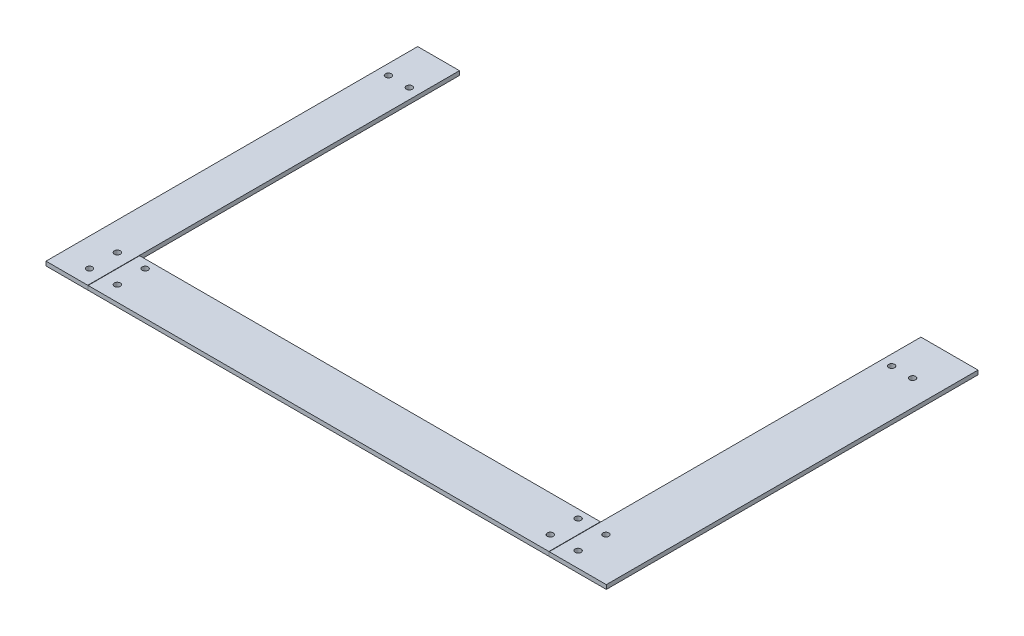
ISO-10303-21;
HEADER;
FILE_DESCRIPTION(('STEP AP214'),'2;1');
FILE_NAME('part.step','',(''),(''),'','','');
FILE_SCHEMA(('AUTOMOTIVE_DESIGN { 1 0 10303 214 1 1 1 1 }'));
ENDSEC;
DATA;
#1=APPLICATION_CONTEXT('core data for automotive mechanical design processes');
#2=APPLICATION_PROTOCOL_DEFINITION('international standard','automotive_design',2000,#1);
#3=PRODUCT_CONTEXT('',#1,'mechanical');
#4=PRODUCT('Part','Part','',(#3));
#5=PRODUCT_RELATED_PRODUCT_CATEGORY('part','',(#4));
#6=PRODUCT_DEFINITION_FORMATION('','',#4);
#7=PRODUCT_DEFINITION_CONTEXT('part definition',#1,'design');
#8=PRODUCT_DEFINITION('design','',#6,#7);
#9=PRODUCT_DEFINITION_SHAPE('','',#8);
#10=(LENGTH_UNIT() NAMED_UNIT(*) SI_UNIT(.MILLI.,.METRE.));
#11=(NAMED_UNIT(*) PLANE_ANGLE_UNIT() SI_UNIT($,.RADIAN.));
#12=(NAMED_UNIT(*) SI_UNIT($,.STERADIAN.) SOLID_ANGLE_UNIT());
#13=UNCERTAINTY_MEASURE_WITH_UNIT(LENGTH_MEASURE(1.E-05),#10,'distance_accuracy_value','');
#14=(GEOMETRIC_REPRESENTATION_CONTEXT(3) GLOBAL_UNCERTAINTY_ASSIGNED_CONTEXT((#13)) GLOBAL_UNIT_ASSIGNED_CONTEXT((#10,
#11,#12)) REPRESENTATION_CONTEXT('',''));
#15=CARTESIAN_POINT('',(0.,0.,0.));
#16=DIRECTION('',(0.,0.,1.));
#17=DIRECTION('',(1.,0.,0.));
#18=AXIS2_PLACEMENT_3D('',#15,#16,#17);
#19=CARTESIAN_POINT('',(165.5,3.,135.5));
#20=DIRECTION('',(-1.,0.,0.));
#21=DIRECTION('',(0.,0.,1.));
#22=AXIS2_PLACEMENT_3D('',#19,#20,#21);
#23=PLANE('',#22);
#24=DIRECTION('',(0.,0.,-1.));
#25=VECTOR('',#24,1.);
#26=CARTESIAN_POINT('',(165.5,0.,135.5));
#27=LINE('',#26,#25);
#28=CARTESIAN_POINT('',(165.5,0.,135.5));
#29=VERTEX_POINT('',#28);
#30=CARTESIAN_POINT('',(165.5,0.,98.5));
#31=VERTEX_POINT('',#30);
#32=EDGE_CURVE('E111',#29,#31,#27,.T.);
#33=ORIENTED_EDGE('',*,*,#32,.T.);
#34=DIRECTION('',(0.,-1.,0.));
#35=VECTOR('',#34,1.);
#36=CARTESIAN_POINT('',(165.5,3.,98.5));
#37=LINE('',#36,#35);
#38=CARTESIAN_POINT('',(165.5,3.,98.5));
#39=VERTEX_POINT('',#38);
#40=EDGE_CURVE('E12',#39,#31,#37,.T.);
#41=ORIENTED_EDGE('',*,*,#40,.F.);
#42=DIRECTION('',(0.,0.,-1.));
#43=VECTOR('',#42,1.);
#44=CARTESIAN_POINT('',(165.5,3.,135.5));
#45=LINE('',#44,#43);
#46=CARTESIAN_POINT('',(165.5,3.,135.5));
#47=VERTEX_POINT('',#46);
#48=EDGE_CURVE('E99',#47,#39,#45,.T.);
#49=ORIENTED_EDGE('',*,*,#48,.F.);
#50=DIRECTION('',(0.,-1.,0.));
#51=VECTOR('',#50,1.);
#52=CARTESIAN_POINT('',(165.5,3.,135.5));
#53=LINE('',#52,#51);
#54=EDGE_CURVE('E107',#47,#29,#53,.T.);
#55=ORIENTED_EDGE('',*,*,#54,.T.);
#56=EDGE_LOOP('',(#33,#41,#49,#55));
#57=FACE_BOUND('',#56,.T.);
#58=ADVANCED_FACE('F48',(#57),#23,.F.);
#59=CARTESIAN_POINT('',(-165.5,3.,98.5));
#60=DIRECTION('',(0.,0.,1.));
#61=DIRECTION('',(1.,0.,0.));
#62=AXIS2_PLACEMENT_3D('',#59,#60,#61);
#63=PLANE('',#62);
#64=DIRECTION('',(-1.,0.,0.));
#65=VECTOR('',#64,1.);
#66=CARTESIAN_POINT('',(-165.5,0.,98.5));
#67=LINE('',#66,#65);
#68=CARTESIAN_POINT('',(-165.5,0.,98.5));
#69=VERTEX_POINT('',#68);
#70=EDGE_CURVE('E103',#31,#69,#67,.T.);
#71=ORIENTED_EDGE('',*,*,#70,.T.);
#72=DIRECTION('',(0.,-1.,0.));
#73=VECTOR('',#72,1.);
#74=CARTESIAN_POINT('',(-165.5,3.,98.5));
#75=LINE('',#74,#73);
#76=CARTESIAN_POINT('',(-165.5,3.,98.5));
#77=VERTEX_POINT('',#76);
#78=EDGE_CURVE('E56',#77,#69,#75,.T.);
#79=ORIENTED_EDGE('',*,*,#78,.F.);
#80=DIRECTION('',(-1.,0.,0.));
#81=VECTOR('',#80,1.);
#82=CARTESIAN_POINT('',(-165.5,3.,98.5));
#83=LINE('',#82,#81);
#84=EDGE_CURVE('E94',#39,#77,#83,.T.);
#85=ORIENTED_EDGE('',*,*,#84,.F.);
#86=ORIENTED_EDGE('',*,*,#40,.T.);
#87=EDGE_LOOP('',(#71,#79,#85,#86));
#88=FACE_BOUND('',#87,.T.);
#89=ADVANCED_FACE('F102',(#88),#63,.F.);
#90=CARTESIAN_POINT('',(-165.5,3.,135.5));
#91=DIRECTION('',(1.,0.,0.));
#92=DIRECTION('',(0.,0.,-1.));
#93=AXIS2_PLACEMENT_3D('',#90,#91,#92);
#94=PLANE('',#93);
#95=DIRECTION('',(0.,0.,1.));
#96=VECTOR('',#95,1.);
#97=CARTESIAN_POINT('',(-165.5,0.,135.5));
#98=LINE('',#97,#96);
#99=CARTESIAN_POINT('',(-165.5,0.,135.5));
#100=VERTEX_POINT('',#99);
#101=EDGE_CURVE('E81',#69,#100,#98,.T.);
#102=ORIENTED_EDGE('',*,*,#101,.T.);
#103=DIRECTION('',(0.,-1.,0.));
#104=VECTOR('',#103,1.);
#105=CARTESIAN_POINT('',(-165.5,3.,135.5));
#106=LINE('',#105,#104);
#107=CARTESIAN_POINT('',(-165.5,3.,135.5));
#108=VERTEX_POINT('',#107);
#109=EDGE_CURVE('E104',#108,#100,#106,.T.);
#110=ORIENTED_EDGE('',*,*,#109,.F.);
#111=DIRECTION('',(0.,0.,1.));
#112=VECTOR('',#111,1.);
#113=CARTESIAN_POINT('',(-165.5,3.,135.5));
#114=LINE('',#113,#112);
#115=EDGE_CURVE('E97',#77,#108,#114,.T.);
#116=ORIENTED_EDGE('',*,*,#115,.F.);
#117=ORIENTED_EDGE('',*,*,#78,.T.);
#118=EDGE_LOOP('',(#102,#110,#116,#117));
#119=FACE_BOUND('',#118,.T.);
#120=ADVANCED_FACE('F105',(#119),#94,.F.);
#121=CARTESIAN_POINT('',(-165.5,3.,135.5));
#122=DIRECTION('',(0.,0.,-1.));
#123=DIRECTION('',(-1.,0.,0.));
#124=AXIS2_PLACEMENT_3D('',#121,#122,#123);
#125=PLANE('',#124);
#126=DIRECTION('',(1.,0.,0.));
#127=VECTOR('',#126,1.);
#128=CARTESIAN_POINT('',(-165.5,0.,135.5));
#129=LINE('',#128,#127);
#130=EDGE_CURVE('E87',#100,#29,#129,.T.);
#131=ORIENTED_EDGE('',*,*,#130,.T.);
#132=ORIENTED_EDGE('',*,*,#54,.F.);
#133=DIRECTION('',(1.,0.,0.));
#134=VECTOR('',#133,1.);
#135=CARTESIAN_POINT('',(-165.5,3.,135.5));
#136=LINE('',#135,#134);
#137=EDGE_CURVE('E64',#108,#47,#136,.T.);
#138=ORIENTED_EDGE('',*,*,#137,.F.);
#139=ORIENTED_EDGE('',*,*,#109,.T.);
#140=EDGE_LOOP('',(#131,#132,#138,#139));
#141=FACE_BOUND('',#140,.T.);
#142=ADVANCED_FACE('F119',(#141),#125,.F.);
#143=CARTESIAN_POINT('',(0.,3.,0.));
#144=DIRECTION('',(0.,-1.,0.));
#145=DIRECTION('',(0.,0.,-1.));
#146=AXIS2_PLACEMENT_3D('',#143,#144,#145);
#147=PLANE('',#146);
#148=CARTESIAN_POINT('',(155.5,3.,124.5));
#149=DIRECTION('',(0.,-1.,0.));
#150=DIRECTION('',(0.,0.,1.));
#151=AXIS2_PLACEMENT_3D('',#148,#149,#150);
#152=CIRCLE('',#151,2.15000000000001);
#153=CARTESIAN_POINT('',(155.5,3.,126.65));
#154=VERTEX_POINT('',#153);
#155=EDGE_CURVE('E142',#154,#154,#152,.T.);
#156=ORIENTED_EDGE('',*,*,#155,.T.);
#157=EDGE_LOOP('',(#156));
#158=FACE_BOUND('',#157,.T.);
#159=CARTESIAN_POINT('',(155.5,3.,104.5));
#160=DIRECTION('',(0.,-1.,0.));
#161=DIRECTION('',(0.,0.,1.));
#162=AXIS2_PLACEMENT_3D('',#159,#160,#161);
#163=CIRCLE('',#162,2.15000000000001);
#164=CARTESIAN_POINT('',(155.5,3.,106.65));
#165=VERTEX_POINT('',#164);
#166=EDGE_CURVE('E136',#165,#165,#163,.T.);
#167=ORIENTED_EDGE('',*,*,#166,.T.);
#168=EDGE_LOOP('',(#167));
#169=FACE_BOUND('',#168,.T.);
#170=CARTESIAN_POINT('',(-155.5,3.,104.5));
#171=DIRECTION('',(0.,1.,0.));
#172=DIRECTION('',(0.,0.,1.));
#173=AXIS2_PLACEMENT_3D('',#170,#171,#172);
#174=CIRCLE('',#173,2.15000000000001);
#175=CARTESIAN_POINT('',(-155.5,3.,106.65));
#176=VERTEX_POINT('',#175);
#177=EDGE_CURVE('E133',#176,#176,#174,.T.);
#178=ORIENTED_EDGE('',*,*,#177,.F.);
#179=EDGE_LOOP('',(#178));
#180=FACE_BOUND('',#179,.T.);
#181=CARTESIAN_POINT('',(-155.5,3.,124.5));
#182=DIRECTION('',(0.,1.,0.));
#183=DIRECTION('',(0.,0.,1.));
#184=AXIS2_PLACEMENT_3D('',#181,#182,#183);
#185=CIRCLE('',#184,2.15000000000001);
#186=CARTESIAN_POINT('',(-155.5,3.,126.65));
#187=VERTEX_POINT('',#186);
#188=EDGE_CURVE('E127',#187,#187,#185,.T.);
#189=ORIENTED_EDGE('',*,*,#188,.F.);
#190=EDGE_LOOP('',(#189));
#191=FACE_BOUND('',#190,.T.);
#192=ORIENTED_EDGE('',*,*,#48,.T.);
#193=ORIENTED_EDGE('',*,*,#84,.T.);
#194=ORIENTED_EDGE('',*,*,#115,.T.);
#195=ORIENTED_EDGE('',*,*,#137,.T.);
#196=EDGE_LOOP('',(#192,#193,#194,#195));
#197=FACE_BOUND('',#196,.T.);
#198=ADVANCED_FACE('F95',(#158,#169,#180,#191,#197),#147,.F.);
#199=CARTESIAN_POINT('',(0.,0.,0.));
#200=DIRECTION('',(0.,-1.,0.));
#201=DIRECTION('',(0.,0.,-1.));
#202=AXIS2_PLACEMENT_3D('',#199,#200,#201);
#203=PLANE('',#202);
#204=CARTESIAN_POINT('',(155.5,0.,124.5));
#205=DIRECTION('',(0.,-1.,0.));
#206=DIRECTION('',(0.,0.,1.));
#207=AXIS2_PLACEMENT_3D('',#204,#205,#206);
#208=CIRCLE('',#207,2.15000000000001);
#209=CARTESIAN_POINT('',(155.5,0.,126.65));
#210=VERTEX_POINT('',#209);
#211=EDGE_CURVE('E145',#210,#210,#208,.T.);
#212=ORIENTED_EDGE('',*,*,#211,.F.);
#213=EDGE_LOOP('',(#212));
#214=FACE_BOUND('',#213,.T.);
#215=CARTESIAN_POINT('',(155.5,0.,104.5));
#216=DIRECTION('',(0.,-1.,0.));
#217=DIRECTION('',(0.,0.,1.));
#218=AXIS2_PLACEMENT_3D('',#215,#216,#217);
#219=CIRCLE('',#218,2.15000000000001);
#220=CARTESIAN_POINT('',(155.5,0.,106.65));
#221=VERTEX_POINT('',#220);
#222=EDGE_CURVE('E139',#221,#221,#219,.T.);
#223=ORIENTED_EDGE('',*,*,#222,.F.);
#224=EDGE_LOOP('',(#223));
#225=FACE_BOUND('',#224,.T.);
#226=CARTESIAN_POINT('',(-155.5,0.,104.5));
#227=DIRECTION('',(0.,1.,0.));
#228=DIRECTION('',(0.,0.,1.));
#229=AXIS2_PLACEMENT_3D('',#226,#227,#228);
#230=CIRCLE('',#229,2.15000000000001);
#231=CARTESIAN_POINT('',(-155.5,0.,106.65));
#232=VERTEX_POINT('',#231);
#233=EDGE_CURVE('E130',#232,#232,#230,.T.);
#234=ORIENTED_EDGE('',*,*,#233,.T.);
#235=EDGE_LOOP('',(#234));
#236=FACE_BOUND('',#235,.T.);
#237=CARTESIAN_POINT('',(-155.5,0.,124.5));
#238=DIRECTION('',(0.,1.,0.));
#239=DIRECTION('',(0.,0.,1.));
#240=AXIS2_PLACEMENT_3D('',#237,#238,#239);
#241=CIRCLE('',#240,2.15000000000001);
#242=CARTESIAN_POINT('',(-155.5,0.,126.65));
#243=VERTEX_POINT('',#242);
#244=EDGE_CURVE('E114',#243,#243,#241,.T.);
#245=ORIENTED_EDGE('',*,*,#244,.T.);
#246=EDGE_LOOP('',(#245));
#247=FACE_BOUND('',#246,.T.);
#248=ORIENTED_EDGE('',*,*,#32,.F.);
#249=ORIENTED_EDGE('',*,*,#130,.F.);
#250=ORIENTED_EDGE('',*,*,#101,.F.);
#251=ORIENTED_EDGE('',*,*,#70,.F.);
#252=EDGE_LOOP('',(#248,#249,#250,#251));
#253=FACE_BOUND('',#252,.T.);
#254=ADVANCED_FACE('F122',(#214,#225,#236,#247,#253),#203,.T.);
#255=CARTESIAN_POINT('',(-155.5,3.,124.5));
#256=DIRECTION('',(0.,1.,0.));
#257=DIRECTION('',(0.,0.,1.));
#258=AXIS2_PLACEMENT_3D('',#255,#256,#257);
#259=CYLINDRICAL_SURFACE('',#258,2.15000000000001);
#260=ORIENTED_EDGE('',*,*,#244,.F.);
#261=EDGE_LOOP('',(#260));
#262=FACE_BOUND('',#261,.T.);
#263=ORIENTED_EDGE('',*,*,#188,.T.);
#264=EDGE_LOOP('',(#263));
#265=FACE_BOUND('',#264,.T.);
#266=ADVANCED_FACE('F154',(#262,#265),#259,.F.);
#267=CARTESIAN_POINT('',(-155.5,3.,104.5));
#268=DIRECTION('',(0.,1.,0.));
#269=DIRECTION('',(0.,0.,1.));
#270=AXIS2_PLACEMENT_3D('',#267,#268,#269);
#271=CYLINDRICAL_SURFACE('',#270,2.15000000000001);
#272=ORIENTED_EDGE('',*,*,#233,.F.);
#273=EDGE_LOOP('',(#272));
#274=FACE_BOUND('',#273,.T.);
#275=ORIENTED_EDGE('',*,*,#177,.T.);
#276=EDGE_LOOP('',(#275));
#277=FACE_BOUND('',#276,.T.);
#278=ADVANCED_FACE('F164',(#274,#277),#271,.F.);
#279=CARTESIAN_POINT('',(155.5,3.,104.5));
#280=DIRECTION('',(0.,1.,0.));
#281=DIRECTION('',(0.,0.,1.));
#282=AXIS2_PLACEMENT_3D('',#279,#280,#281);
#283=CYLINDRICAL_SURFACE('',#282,2.15000000000001);
#284=ORIENTED_EDGE('',*,*,#222,.T.);
#285=EDGE_LOOP('',(#284));
#286=FACE_BOUND('',#285,.T.);
#287=ORIENTED_EDGE('',*,*,#166,.F.);
#288=EDGE_LOOP('',(#287));
#289=FACE_BOUND('',#288,.T.);
#290=ADVANCED_FACE('F206',(#286,#289),#283,.F.);
#291=CARTESIAN_POINT('',(155.5,3.,124.5));
#292=DIRECTION('',(0.,1.,0.));
#293=DIRECTION('',(0.,0.,1.));
#294=AXIS2_PLACEMENT_3D('',#291,#292,#293);
#295=CYLINDRICAL_SURFACE('',#294,2.15000000000001);
#296=ORIENTED_EDGE('',*,*,#211,.T.);
#297=EDGE_LOOP('',(#296));
#298=FACE_BOUND('',#297,.T.);
#299=ORIENTED_EDGE('',*,*,#155,.F.);
#300=EDGE_LOOP('',(#299));
#301=FACE_BOUND('',#300,.T.);
#302=ADVANCED_FACE('F149',(#298,#301),#295,.F.);
#303=CLOSED_SHELL('',(#58,#89,#120,#142,#198,#254,#266,#278,#290,#302));
#304=MANIFOLD_SOLID_BREP('B2',#303);
#305=CARTESIAN_POINT('',(-165.75,3.,135.5));
#306=DIRECTION('',(-1.,0.,0.));
#307=DIRECTION('',(0.,0.,1.));
#308=AXIS2_PLACEMENT_3D('',#305,#306,#307);
#309=PLANE('',#308);
#310=DIRECTION('',(0.,0.,-1.));
#311=VECTOR('',#310,1.);
#312=CARTESIAN_POINT('',(-165.75,0.,135.5));
#313=LINE('',#312,#311);
#314=CARTESIAN_POINT('',(-165.75,0.,135.5));
#315=VERTEX_POINT('',#314);
#316=CARTESIAN_POINT('',(-165.75,0.,-131.5));
#317=VERTEX_POINT('',#316);
#318=EDGE_CURVE('E328',#315,#317,#313,.T.);
#319=ORIENTED_EDGE('',*,*,#318,.T.);
#320=DIRECTION('',(0.,-1.,0.));
#321=VECTOR('',#320,1.);
#322=CARTESIAN_POINT('',(-165.75,3.,-131.5));
#323=LINE('',#322,#321);
#324=CARTESIAN_POINT('',(-165.75,3.,-131.5));
#325=VERTEX_POINT('',#324);
#326=EDGE_CURVE('E46',#325,#317,#323,.T.);
#327=ORIENTED_EDGE('',*,*,#326,.F.);
#328=DIRECTION('',(0.,0.,-1.));
#329=VECTOR('',#328,1.);
#330=CARTESIAN_POINT('',(-165.75,3.,135.5));
#331=LINE('',#330,#329);
#332=CARTESIAN_POINT('',(-165.75,3.,135.5));
#333=VERTEX_POINT('',#332);
#334=EDGE_CURVE('E316',#333,#325,#331,.T.);
#335=ORIENTED_EDGE('',*,*,#334,.F.);
#336=DIRECTION('',(0.,-1.,0.));
#337=VECTOR('',#336,1.);
#338=CARTESIAN_POINT('',(-165.75,3.,135.5));
#339=LINE('',#338,#337);
#340=EDGE_CURVE('E324',#333,#315,#339,.T.);
#341=ORIENTED_EDGE('',*,*,#340,.T.);
#342=EDGE_LOOP('',(#319,#327,#335,#341));
#343=FACE_BOUND('',#342,.T.);
#344=ADVANCED_FACE('F265',(#343),#309,.F.);
#345=CARTESIAN_POINT('',(-195.75,3.,-131.5));
#346=DIRECTION('',(0.,0.,1.));
#347=DIRECTION('',(1.,0.,0.));
#348=AXIS2_PLACEMENT_3D('',#345,#346,#347);
#349=PLANE('',#348);
#350=DIRECTION('',(-1.,0.,0.));
#351=VECTOR('',#350,1.);
#352=CARTESIAN_POINT('',(-195.75,0.,-131.5));
#353=LINE('',#352,#351);
#354=CARTESIAN_POINT('',(-195.75,0.,-131.5));
#355=VERTEX_POINT('',#354);
#356=EDGE_CURVE('E320',#317,#355,#353,.T.);
#357=ORIENTED_EDGE('',*,*,#356,.T.);
#358=DIRECTION('',(0.,-1.,0.));
#359=VECTOR('',#358,1.);
#360=CARTESIAN_POINT('',(-195.75,3.,-131.5));
#361=LINE('',#360,#359);
#362=CARTESIAN_POINT('',(-195.75,3.,-131.5));
#363=VERTEX_POINT('',#362);
#364=EDGE_CURVE('E273',#363,#355,#361,.T.);
#365=ORIENTED_EDGE('',*,*,#364,.F.);
#366=DIRECTION('',(-1.,0.,0.));
#367=VECTOR('',#366,1.);
#368=CARTESIAN_POINT('',(-195.75,3.,-131.5));
#369=LINE('',#368,#367);
#370=EDGE_CURVE('E311',#325,#363,#369,.T.);
#371=ORIENTED_EDGE('',*,*,#370,.F.);
#372=ORIENTED_EDGE('',*,*,#326,.T.);
#373=EDGE_LOOP('',(#357,#365,#371,#372));
#374=FACE_BOUND('',#373,.T.);
#375=ADVANCED_FACE('F319',(#374),#349,.F.);
#376=CARTESIAN_POINT('',(-195.75,3.,135.5));
#377=DIRECTION('',(1.,0.,0.));
#378=DIRECTION('',(0.,0.,-1.));
#379=AXIS2_PLACEMENT_3D('',#376,#377,#378);
#380=PLANE('',#379);
#381=DIRECTION('',(0.,0.,1.));
#382=VECTOR('',#381,1.);
#383=CARTESIAN_POINT('',(-195.75,0.,135.5));
#384=LINE('',#383,#382);
#385=CARTESIAN_POINT('',(-195.75,0.,135.5));
#386=VERTEX_POINT('',#385);
#387=EDGE_CURVE('E298',#355,#386,#384,.T.);
#388=ORIENTED_EDGE('',*,*,#387,.T.);
#389=DIRECTION('',(0.,-1.,0.));
#390=VECTOR('',#389,1.);
#391=CARTESIAN_POINT('',(-195.75,3.,135.5));
#392=LINE('',#391,#390);
#393=CARTESIAN_POINT('',(-195.75,3.,135.5));
#394=VERTEX_POINT('',#393);
#395=EDGE_CURVE('E321',#394,#386,#392,.T.);
#396=ORIENTED_EDGE('',*,*,#395,.F.);
#397=DIRECTION('',(0.,0.,1.));
#398=VECTOR('',#397,1.);
#399=CARTESIAN_POINT('',(-195.75,3.,135.5));
#400=LINE('',#399,#398);
#401=EDGE_CURVE('E314',#363,#394,#400,.T.);
#402=ORIENTED_EDGE('',*,*,#401,.F.);
#403=ORIENTED_EDGE('',*,*,#364,.T.);
#404=EDGE_LOOP('',(#388,#396,#402,#403));
#405=FACE_BOUND('',#404,.T.);
#406=ADVANCED_FACE('F322',(#405),#380,.F.);
#407=CARTESIAN_POINT('',(-195.75,3.,135.5));
#408=DIRECTION('',(0.,0.,-1.));
#409=DIRECTION('',(-1.,0.,0.));
#410=AXIS2_PLACEMENT_3D('',#407,#408,#409);
#411=PLANE('',#410);
#412=DIRECTION('',(1.,0.,0.));
#413=VECTOR('',#412,1.);
#414=CARTESIAN_POINT('',(-195.75,0.,135.5));
#415=LINE('',#414,#413);
#416=EDGE_CURVE('E304',#386,#315,#415,.T.);
#417=ORIENTED_EDGE('',*,*,#416,.T.);
#418=ORIENTED_EDGE('',*,*,#340,.F.);
#419=DIRECTION('',(1.,0.,0.));
#420=VECTOR('',#419,1.);
#421=CARTESIAN_POINT('',(-195.75,3.,135.5));
#422=LINE('',#421,#420);
#423=EDGE_CURVE('E281',#394,#333,#422,.T.);
#424=ORIENTED_EDGE('',*,*,#423,.F.);
#425=ORIENTED_EDGE('',*,*,#395,.T.);
#426=EDGE_LOOP('',(#417,#418,#424,#425));
#427=FACE_BOUND('',#426,.T.);
#428=ADVANCED_FACE('F336',(#427),#411,.F.);
#429=CARTESIAN_POINT('',(0.,3.,0.));
#430=DIRECTION('',(0.,-1.,0.));
#431=DIRECTION('',(0.,0.,-1.));
#432=AXIS2_PLACEMENT_3D('',#429,#430,#431);
#433=PLANE('',#432);
#434=CARTESIAN_POINT('',(-175.5,3.,124.5));
#435=DIRECTION('',(0.,1.,0.));
#436=DIRECTION('',(0.,0.,1.));
#437=AXIS2_PLACEMENT_3D('',#434,#435,#436);
#438=CIRCLE('',#437,2.15000000000001);
#439=CARTESIAN_POINT('',(-175.5,3.,126.65));
#440=VERTEX_POINT('',#439);
#441=EDGE_CURVE('E362',#440,#440,#438,.T.);
#442=ORIENTED_EDGE('',*,*,#441,.F.);
#443=EDGE_LOOP('',(#442));
#444=FACE_BOUND('',#443,.T.);
#445=CARTESIAN_POINT('',(-175.5,3.,104.5));
#446=DIRECTION('',(0.,1.,0.));
#447=DIRECTION('',(0.,0.,1.));
#448=AXIS2_PLACEMENT_3D('',#445,#446,#447);
#449=CIRCLE('',#448,2.15000000000001);
#450=CARTESIAN_POINT('',(-175.5,3.,106.65));
#451=VERTEX_POINT('',#450);
#452=EDGE_CURVE('E356',#451,#451,#449,.T.);
#453=ORIENTED_EDGE('',*,*,#452,.F.);
#454=EDGE_LOOP('',(#453));
#455=FACE_BOUND('',#454,.T.);
#456=CARTESIAN_POINT('',(-188.25,3.,-103.));
#457=DIRECTION('',(0.,1.,0.));
#458=DIRECTION('',(0.,0.,1.));
#459=AXIS2_PLACEMENT_3D('',#456,#457,#458);
#460=CIRCLE('',#459,2.15000000000001);
#461=CARTESIAN_POINT('',(-188.25,3.,-100.85));
#462=VERTEX_POINT('',#461);
#463=EDGE_CURVE('E350',#462,#462,#460,.T.);
#464=ORIENTED_EDGE('',*,*,#463,.F.);
#465=EDGE_LOOP('',(#464));
#466=FACE_BOUND('',#465,.T.);
#467=CARTESIAN_POINT('',(-173.25,3.,-103.));
#468=DIRECTION('',(0.,1.,0.));
#469=DIRECTION('',(0.,0.,1.));
#470=AXIS2_PLACEMENT_3D('',#467,#468,#469);
#471=CIRCLE('',#470,2.15000000000001);
#472=CARTESIAN_POINT('',(-173.25,3.,-100.85));
#473=VERTEX_POINT('',#472);
#474=EDGE_CURVE('E344',#473,#473,#471,.T.);
#475=ORIENTED_EDGE('',*,*,#474,.F.);
#476=EDGE_LOOP('',(#475));
#477=FACE_BOUND('',#476,.T.);
#478=ORIENTED_EDGE('',*,*,#334,.T.);
#479=ORIENTED_EDGE('',*,*,#370,.T.);
#480=ORIENTED_EDGE('',*,*,#401,.T.);
#481=ORIENTED_EDGE('',*,*,#423,.T.);
#482=EDGE_LOOP('',(#478,#479,#480,#481));
#483=FACE_BOUND('',#482,.T.);
#484=ADVANCED_FACE('F312',(#444,#455,#466,#477,#483),#433,.F.);
#485=CARTESIAN_POINT('',(0.,0.,0.));
#486=DIRECTION('',(0.,-1.,0.));
#487=DIRECTION('',(0.,0.,-1.));
#488=AXIS2_PLACEMENT_3D('',#485,#486,#487);
#489=PLANE('',#488);
#490=CARTESIAN_POINT('',(-175.5,0.,124.5));
#491=DIRECTION('',(0.,1.,0.));
#492=DIRECTION('',(0.,0.,1.));
#493=AXIS2_PLACEMENT_3D('',#490,#491,#492);
#494=CIRCLE('',#493,2.14999999999999);
#495=CARTESIAN_POINT('',(-175.5,0.,126.65));
#496=VERTEX_POINT('',#495);
#497=EDGE_CURVE('E359',#496,#496,#494,.T.);
#498=ORIENTED_EDGE('',*,*,#497,.T.);
#499=EDGE_LOOP('',(#498));
#500=FACE_BOUND('',#499,.T.);
#501=CARTESIAN_POINT('',(-175.5,0.,104.5));
#502=DIRECTION('',(0.,1.,0.));
#503=DIRECTION('',(0.,0.,1.));
#504=AXIS2_PLACEMENT_3D('',#501,#502,#503);
#505=CIRCLE('',#504,2.14999999999999);
#506=CARTESIAN_POINT('',(-175.5,0.,106.65));
#507=VERTEX_POINT('',#506);
#508=EDGE_CURVE('E353',#507,#507,#505,.T.);
#509=ORIENTED_EDGE('',*,*,#508,.T.);
#510=EDGE_LOOP('',(#509));
#511=FACE_BOUND('',#510,.T.);
#512=CARTESIAN_POINT('',(-188.25,0.,-103.));
#513=DIRECTION('',(0.,1.,0.));
#514=DIRECTION('',(0.,0.,1.));
#515=AXIS2_PLACEMENT_3D('',#512,#513,#514);
#516=CIRCLE('',#515,2.14999999999999);
#517=CARTESIAN_POINT('',(-188.25,0.,-100.85));
#518=VERTEX_POINT('',#517);
#519=EDGE_CURVE('E347',#518,#518,#516,.T.);
#520=ORIENTED_EDGE('',*,*,#519,.T.);
#521=EDGE_LOOP('',(#520));
#522=FACE_BOUND('',#521,.T.);
#523=CARTESIAN_POINT('',(-173.25,0.,-103.));
#524=DIRECTION('',(0.,1.,0.));
#525=DIRECTION('',(0.,0.,1.));
#526=AXIS2_PLACEMENT_3D('',#523,#524,#525);
#527=CIRCLE('',#526,2.14999999999999);
#528=CARTESIAN_POINT('',(-173.25,0.,-100.85));
#529=VERTEX_POINT('',#528);
#530=EDGE_CURVE('E331',#529,#529,#527,.T.);
#531=ORIENTED_EDGE('',*,*,#530,.T.);
#532=EDGE_LOOP('',(#531));
#533=FACE_BOUND('',#532,.T.);
#534=ORIENTED_EDGE('',*,*,#318,.F.);
#535=ORIENTED_EDGE('',*,*,#416,.F.);
#536=ORIENTED_EDGE('',*,*,#387,.F.);
#537=ORIENTED_EDGE('',*,*,#356,.F.);
#538=EDGE_LOOP('',(#534,#535,#536,#537));
#539=FACE_BOUND('',#538,.T.);
#540=ADVANCED_FACE('F339',(#500,#511,#522,#533,#539),#489,.T.);
#541=CARTESIAN_POINT('',(-173.25,3.,-103.));
#542=DIRECTION('',(0.,1.,0.));
#543=DIRECTION('',(0.,0.,1.));
#544=AXIS2_PLACEMENT_3D('',#541,#542,#543);
#545=CYLINDRICAL_SURFACE('',#544,2.15);
#546=ORIENTED_EDGE('',*,*,#530,.F.);
#547=EDGE_LOOP('',(#546));
#548=FACE_BOUND('',#547,.T.);
#549=ORIENTED_EDGE('',*,*,#474,.T.);
#550=EDGE_LOOP('',(#549));
#551=FACE_BOUND('',#550,.T.);
#552=ADVANCED_FACE('F377',(#548,#551),#545,.F.);
#553=CARTESIAN_POINT('',(-188.25,3.,-103.));
#554=DIRECTION('',(0.,1.,0.));
#555=DIRECTION('',(0.,0.,1.));
#556=AXIS2_PLACEMENT_3D('',#553,#554,#555);
#557=CYLINDRICAL_SURFACE('',#556,2.15);
#558=ORIENTED_EDGE('',*,*,#519,.F.);
#559=EDGE_LOOP('',(#558));
#560=FACE_BOUND('',#559,.T.);
#561=ORIENTED_EDGE('',*,*,#463,.T.);
#562=EDGE_LOOP('',(#561));
#563=FACE_BOUND('',#562,.T.);
#564=ADVANCED_FACE('F379',(#560,#563),#557,.F.);
#565=CARTESIAN_POINT('',(-175.5,3.,104.5));
#566=DIRECTION('',(0.,1.,0.));
#567=DIRECTION('',(0.,0.,1.));
#568=AXIS2_PLACEMENT_3D('',#565,#566,#567);
#569=CYLINDRICAL_SURFACE('',#568,2.15);
#570=ORIENTED_EDGE('',*,*,#508,.F.);
#571=EDGE_LOOP('',(#570));
#572=FACE_BOUND('',#571,.T.);
#573=ORIENTED_EDGE('',*,*,#452,.T.);
#574=EDGE_LOOP('',(#573));
#575=FACE_BOUND('',#574,.T.);
#576=ADVANCED_FACE('F386',(#572,#575),#569,.F.);
#577=CARTESIAN_POINT('',(-175.5,3.,124.5));
#578=DIRECTION('',(0.,1.,0.));
#579=DIRECTION('',(0.,0.,1.));
#580=AXIS2_PLACEMENT_3D('',#577,#578,#579);
#581=CYLINDRICAL_SURFACE('',#580,2.15);
#582=ORIENTED_EDGE('',*,*,#497,.F.);
#583=EDGE_LOOP('',(#582));
#584=FACE_BOUND('',#583,.T.);
#585=ORIENTED_EDGE('',*,*,#441,.T.);
#586=EDGE_LOOP('',(#585));
#587=FACE_BOUND('',#586,.T.);
#588=ADVANCED_FACE('F366',(#584,#587),#581,.F.);
#589=CLOSED_SHELL('',(#344,#375,#406,#428,#484,#540,#552,#564,#576,#588));
#590=MANIFOLD_SOLID_BREP('B6',#589);
#591=CARTESIAN_POINT('',(206.75,3.,135.5));
#592=DIRECTION('',(-1.,0.,0.));
#593=DIRECTION('',(0.,0.,1.));
#594=AXIS2_PLACEMENT_3D('',#591,#592,#593);
#595=PLANE('',#594);
#596=DIRECTION('',(0.,0.,-1.));
#597=VECTOR('',#596,1.);
#598=CARTESIAN_POINT('',(206.75,0.,135.5));
#599=LINE('',#598,#597);
#600=CARTESIAN_POINT('',(206.75,0.,135.5));
#601=VERTEX_POINT('',#600);
#602=CARTESIAN_POINT('',(206.75,0.,-131.5));
#603=VERTEX_POINT('',#602);
#604=EDGE_CURVE('E536',#601,#603,#599,.T.);
#605=ORIENTED_EDGE('',*,*,#604,.T.);
#606=DIRECTION('',(0.,-1.,0.));
#607=VECTOR('',#606,1.);
#608=CARTESIAN_POINT('',(206.75,3.,-131.5));
#609=LINE('',#608,#607);
#610=CARTESIAN_POINT('',(206.75,3.,-131.5));
#611=VERTEX_POINT('',#610);
#612=EDGE_CURVE('E263',#611,#603,#609,.T.);
#613=ORIENTED_EDGE('',*,*,#612,.F.);
#614=DIRECTION('',(0.,0.,-1.));
#615=VECTOR('',#614,1.);
#616=CARTESIAN_POINT('',(206.75,3.,135.5));
#617=LINE('',#616,#615);
#618=CARTESIAN_POINT('',(206.75,3.,135.5));
#619=VERTEX_POINT('',#618);
#620=EDGE_CURVE('E524',#619,#611,#617,.T.);
#621=ORIENTED_EDGE('',*,*,#620,.F.);
#622=DIRECTION('',(0.,-1.,0.));
#623=VECTOR('',#622,1.);
#624=CARTESIAN_POINT('',(206.75,3.,135.5));
#625=LINE('',#624,#623);
#626=EDGE_CURVE('E532',#619,#601,#625,.T.);
#627=ORIENTED_EDGE('',*,*,#626,.T.);
#628=EDGE_LOOP('',(#605,#613,#621,#627));
#629=FACE_BOUND('',#628,.T.);
#630=ADVANCED_FACE('F473',(#629),#595,.F.);
#631=CARTESIAN_POINT('',(165.75,3.,-131.5));
#632=DIRECTION('',(0.,0.,1.));
#633=DIRECTION('',(1.,0.,0.));
#634=AXIS2_PLACEMENT_3D('',#631,#632,#633);
#635=PLANE('',#634);
#636=DIRECTION('',(-1.,0.,0.));
#637=VECTOR('',#636,1.);
#638=CARTESIAN_POINT('',(165.75,0.,-131.5));
#639=LINE('',#638,#637);
#640=CARTESIAN_POINT('',(165.75,0.,-131.5));
#641=VERTEX_POINT('',#640);
#642=EDGE_CURVE('E528',#603,#641,#639,.T.);
#643=ORIENTED_EDGE('',*,*,#642,.T.);
#644=DIRECTION('',(0.,-1.,0.));
#645=VECTOR('',#644,1.);
#646=CARTESIAN_POINT('',(165.75,3.,-131.5));
#647=LINE('',#646,#645);
#648=CARTESIAN_POINT('',(165.75,3.,-131.5));
#649=VERTEX_POINT('',#648);
#650=EDGE_CURVE('E481',#649,#641,#647,.T.);
#651=ORIENTED_EDGE('',*,*,#650,.F.);
#652=DIRECTION('',(-1.,0.,0.));
#653=VECTOR('',#652,1.);
#654=CARTESIAN_POINT('',(165.75,3.,-131.5));
#655=LINE('',#654,#653);
#656=EDGE_CURVE('E519',#611,#649,#655,.T.);
#657=ORIENTED_EDGE('',*,*,#656,.F.);
#658=ORIENTED_EDGE('',*,*,#612,.T.);
#659=EDGE_LOOP('',(#643,#651,#657,#658));
#660=FACE_BOUND('',#659,.T.);
#661=ADVANCED_FACE('F527',(#660),#635,.F.);
#662=CARTESIAN_POINT('',(165.75,3.,135.5));
#663=DIRECTION('',(1.,0.,0.));
#664=DIRECTION('',(0.,0.,-1.));
#665=AXIS2_PLACEMENT_3D('',#662,#663,#664);
#666=PLANE('',#665);
#667=DIRECTION('',(0.,0.,1.));
#668=VECTOR('',#667,1.);
#669=CARTESIAN_POINT('',(165.75,0.,135.5));
#670=LINE('',#669,#668);
#671=CARTESIAN_POINT('',(165.75,0.,135.5));
#672=VERTEX_POINT('',#671);
#673=EDGE_CURVE('E506',#641,#672,#670,.T.);
#674=ORIENTED_EDGE('',*,*,#673,.T.);
#675=DIRECTION('',(0.,-1.,0.));
#676=VECTOR('',#675,1.);
#677=CARTESIAN_POINT('',(165.75,3.,135.5));
#678=LINE('',#677,#676);
#679=CARTESIAN_POINT('',(165.75,3.,135.5));
#680=VERTEX_POINT('',#679);
#681=EDGE_CURVE('E529',#680,#672,#678,.T.);
#682=ORIENTED_EDGE('',*,*,#681,.F.);
#683=DIRECTION('',(0.,0.,1.));
#684=VECTOR('',#683,1.);
#685=CARTESIAN_POINT('',(165.75,3.,135.5));
#686=LINE('',#685,#684);
#687=EDGE_CURVE('E522',#649,#680,#686,.T.);
#688=ORIENTED_EDGE('',*,*,#687,.F.);
#689=ORIENTED_EDGE('',*,*,#650,.T.);
#690=EDGE_LOOP('',(#674,#682,#688,#689));
#691=FACE_BOUND('',#690,.T.);
#692=ADVANCED_FACE('F530',(#691),#666,.F.);
#693=CARTESIAN_POINT('',(165.75,3.,135.5));
#694=DIRECTION('',(0.,0.,-1.));
#695=DIRECTION('',(-1.,0.,0.));
#696=AXIS2_PLACEMENT_3D('',#693,#694,#695);
#697=PLANE('',#696);
#698=DIRECTION('',(1.,0.,0.));
#699=VECTOR('',#698,1.);
#700=CARTESIAN_POINT('',(165.75,0.,135.5));
#701=LINE('',#700,#699);
#702=EDGE_CURVE('E512',#672,#601,#701,.T.);
#703=ORIENTED_EDGE('',*,*,#702,.T.);
#704=ORIENTED_EDGE('',*,*,#626,.F.);
#705=DIRECTION('',(1.,0.,0.));
#706=VECTOR('',#705,1.);
#707=CARTESIAN_POINT('',(165.75,3.,135.5));
#708=LINE('',#707,#706);
#709=EDGE_CURVE('E489',#680,#619,#708,.T.);
#710=ORIENTED_EDGE('',*,*,#709,.F.);
#711=ORIENTED_EDGE('',*,*,#681,.T.);
#712=EDGE_LOOP('',(#703,#704,#710,#711));
#713=FACE_BOUND('',#712,.T.);
#714=ADVANCED_FACE('F544',(#713),#697,.F.);
#715=CARTESIAN_POINT('',(0.,3.,0.));
#716=DIRECTION('',(0.,-1.,0.));
#717=DIRECTION('',(0.,0.,-1.));
#718=AXIS2_PLACEMENT_3D('',#715,#716,#717);
#719=PLANE('',#718);
#720=CARTESIAN_POINT('',(175.5,3.,104.5));
#721=DIRECTION('',(0.,-1.,0.));
#722=DIRECTION('',(0.,0.,1.));
#723=AXIS2_PLACEMENT_3D('',#720,#721,#722);
#724=CIRCLE('',#723,2.15000000000001);
#725=CARTESIAN_POINT('',(175.5,3.,106.65));
#726=VERTEX_POINT('',#725);
#727=EDGE_CURVE('E567',#726,#726,#724,.T.);
#728=ORIENTED_EDGE('',*,*,#727,.T.);
#729=EDGE_LOOP('',(#728));
#730=FACE_BOUND('',#729,.T.);
#731=CARTESIAN_POINT('',(188.25,3.,-103.));
#732=DIRECTION('',(0.,-1.,0.));
#733=DIRECTION('',(0.,0.,1.));
#734=AXIS2_PLACEMENT_3D('',#731,#732,#733);
#735=CIRCLE('',#734,2.15000000000001);
#736=CARTESIAN_POINT('',(188.25,3.,-100.85));
#737=VERTEX_POINT('',#736);
#738=EDGE_CURVE('E561',#737,#737,#735,.T.);
#739=ORIENTED_EDGE('',*,*,#738,.T.);
#740=EDGE_LOOP('',(#739));
#741=FACE_BOUND('',#740,.T.);
#742=CARTESIAN_POINT('',(173.25,3.,-103.));
#743=DIRECTION('',(0.,-1.,0.));
#744=DIRECTION('',(0.,0.,1.));
#745=AXIS2_PLACEMENT_3D('',#742,#743,#744);
#746=CIRCLE('',#745,2.15000000000001);
#747=CARTESIAN_POINT('',(173.25,3.,-100.85));
#748=VERTEX_POINT('',#747);
#749=EDGE_CURVE('E555',#748,#748,#746,.T.);
#750=ORIENTED_EDGE('',*,*,#749,.T.);
#751=EDGE_LOOP('',(#750));
#752=FACE_BOUND('',#751,.T.);
#753=CARTESIAN_POINT('',(175.5,3.,124.5));
#754=DIRECTION('',(0.,-1.,0.));
#755=DIRECTION('',(0.,0.,1.));
#756=AXIS2_PLACEMENT_3D('',#753,#754,#755);
#757=CIRCLE('',#756,2.15000000000001);
#758=CARTESIAN_POINT('',(175.5,3.,126.65));
#759=VERTEX_POINT('',#758);
#760=EDGE_CURVE('E539',#759,#759,#757,.T.);
#761=ORIENTED_EDGE('',*,*,#760,.T.);
#762=EDGE_LOOP('',(#761));
#763=FACE_BOUND('',#762,.T.);
#764=ORIENTED_EDGE('',*,*,#620,.T.);
#765=ORIENTED_EDGE('',*,*,#656,.T.);
#766=ORIENTED_EDGE('',*,*,#687,.T.);
#767=ORIENTED_EDGE('',*,*,#709,.T.);
#768=EDGE_LOOP('',(#764,#765,#766,#767));
#769=FACE_BOUND('',#768,.T.);
#770=ADVANCED_FACE('F520',(#730,#741,#752,#763,#769),#719,.F.);
#771=CARTESIAN_POINT('',(0.,0.,0.));
#772=DIRECTION('',(0.,-1.,0.));
#773=DIRECTION('',(0.,0.,-1.));
#774=AXIS2_PLACEMENT_3D('',#771,#772,#773);
#775=PLANE('',#774);
#776=CARTESIAN_POINT('',(175.5,0.,104.5));
#777=DIRECTION('',(0.,-1.,0.));
#778=DIRECTION('',(0.,0.,1.));
#779=AXIS2_PLACEMENT_3D('',#776,#777,#778);
#780=CIRCLE('',#779,2.14999999999999);
#781=CARTESIAN_POINT('',(175.5,0.,106.65));
#782=VERTEX_POINT('',#781);
#783=EDGE_CURVE('E570',#782,#782,#780,.T.);
#784=ORIENTED_EDGE('',*,*,#783,.F.);
#785=EDGE_LOOP('',(#784));
#786=FACE_BOUND('',#785,.T.);
#787=CARTESIAN_POINT('',(188.25,0.,-103.));
#788=DIRECTION('',(0.,-1.,0.));
#789=DIRECTION('',(0.,0.,1.));
#790=AXIS2_PLACEMENT_3D('',#787,#788,#789);
#791=CIRCLE('',#790,2.14999999999999);
#792=CARTESIAN_POINT('',(188.25,0.,-100.85));
#793=VERTEX_POINT('',#792);
#794=EDGE_CURVE('E564',#793,#793,#791,.T.);
#795=ORIENTED_EDGE('',*,*,#794,.F.);
#796=EDGE_LOOP('',(#795));
#797=FACE_BOUND('',#796,.T.);
#798=CARTESIAN_POINT('',(173.25,0.,-103.));
#799=DIRECTION('',(0.,-1.,0.));
#800=DIRECTION('',(0.,0.,1.));
#801=AXIS2_PLACEMENT_3D('',#798,#799,#800);
#802=CIRCLE('',#801,2.14999999999999);
#803=CARTESIAN_POINT('',(173.25,0.,-100.85));
#804=VERTEX_POINT('',#803);
#805=EDGE_CURVE('E558',#804,#804,#802,.T.);
#806=ORIENTED_EDGE('',*,*,#805,.F.);
#807=EDGE_LOOP('',(#806));
#808=FACE_BOUND('',#807,.T.);
#809=CARTESIAN_POINT('',(175.5,0.,124.5));
#810=DIRECTION('',(0.,-1.,0.));
#811=DIRECTION('',(0.,0.,1.));
#812=AXIS2_PLACEMENT_3D('',#809,#810,#811);
#813=CIRCLE('',#812,2.14999999999999);
#814=CARTESIAN_POINT('',(175.5,0.,126.65));
#815=VERTEX_POINT('',#814);
#816=EDGE_CURVE('E552',#815,#815,#813,.T.);
#817=ORIENTED_EDGE('',*,*,#816,.F.);
#818=EDGE_LOOP('',(#817));
#819=FACE_BOUND('',#818,.T.);
#820=ORIENTED_EDGE('',*,*,#604,.F.);
#821=ORIENTED_EDGE('',*,*,#702,.F.);
#822=ORIENTED_EDGE('',*,*,#673,.F.);
#823=ORIENTED_EDGE('',*,*,#642,.F.);
#824=EDGE_LOOP('',(#820,#821,#822,#823));
#825=FACE_BOUND('',#824,.T.);
#826=ADVANCED_FACE('F547',(#786,#797,#808,#819,#825),#775,.T.);
#827=CARTESIAN_POINT('',(175.5,3.,124.5));
#828=DIRECTION('',(0.,1.,0.));
#829=DIRECTION('',(0.,0.,1.));
#830=AXIS2_PLACEMENT_3D('',#827,#828,#829);
#831=CYLINDRICAL_SURFACE('',#830,2.15);
#832=ORIENTED_EDGE('',*,*,#816,.T.);
#833=EDGE_LOOP('',(#832));
#834=FACE_BOUND('',#833,.T.);
#835=ORIENTED_EDGE('',*,*,#760,.F.);
#836=EDGE_LOOP('',(#835));
#837=FACE_BOUND('',#836,.T.);
#838=ADVANCED_FACE('F579',(#834,#837),#831,.F.);
#839=CARTESIAN_POINT('',(173.25,3.,-103.));
#840=DIRECTION('',(0.,1.,0.));
#841=DIRECTION('',(0.,0.,1.));
#842=AXIS2_PLACEMENT_3D('',#839,#840,#841);
#843=CYLINDRICAL_SURFACE('',#842,2.15);
#844=ORIENTED_EDGE('',*,*,#805,.T.);
#845=EDGE_LOOP('',(#844));
#846=FACE_BOUND('',#845,.T.);
#847=ORIENTED_EDGE('',*,*,#749,.F.);
#848=EDGE_LOOP('',(#847));
#849=FACE_BOUND('',#848,.T.);
#850=ADVANCED_FACE('F589',(#846,#849),#843,.F.);
#851=CARTESIAN_POINT('',(188.25,3.,-103.));
#852=DIRECTION('',(0.,1.,0.));
#853=DIRECTION('',(0.,0.,1.));
#854=AXIS2_PLACEMENT_3D('',#851,#852,#853);
#855=CYLINDRICAL_SURFACE('',#854,2.15);
#856=ORIENTED_EDGE('',*,*,#794,.T.);
#857=EDGE_LOOP('',(#856));
#858=FACE_BOUND('',#857,.T.);
#859=ORIENTED_EDGE('',*,*,#738,.F.);
#860=EDGE_LOOP('',(#859));
#861=FACE_BOUND('',#860,.T.);
#862=ADVANCED_FACE('F640',(#858,#861),#855,.F.);
#863=CARTESIAN_POINT('',(175.5,3.,104.5));
#864=DIRECTION('',(0.,1.,0.));
#865=DIRECTION('',(0.,0.,1.));
#866=AXIS2_PLACEMENT_3D('',#863,#864,#865);
#867=CYLINDRICAL_SURFACE('',#866,2.15);
#868=ORIENTED_EDGE('',*,*,#783,.T.);
#869=EDGE_LOOP('',(#868));
#870=FACE_BOUND('',#869,.T.);
#871=ORIENTED_EDGE('',*,*,#727,.F.);
#872=EDGE_LOOP('',(#871));
#873=FACE_BOUND('',#872,.T.);
#874=ADVANCED_FACE('F574',(#870,#873),#867,.F.);
#875=CLOSED_SHELL('',(#630,#661,#692,#714,#770,#826,#838,#850,#862,#874));
#876=MANIFOLD_SOLID_BREP('B40',#875);
#877=ADVANCED_BREP_SHAPE_REPRESENTATION('',(#18,#304,#590,#876),#14);
#878=SHAPE_DEFINITION_REPRESENTATION(#9,#877);
ENDSEC;
END-ISO-10303-21;
